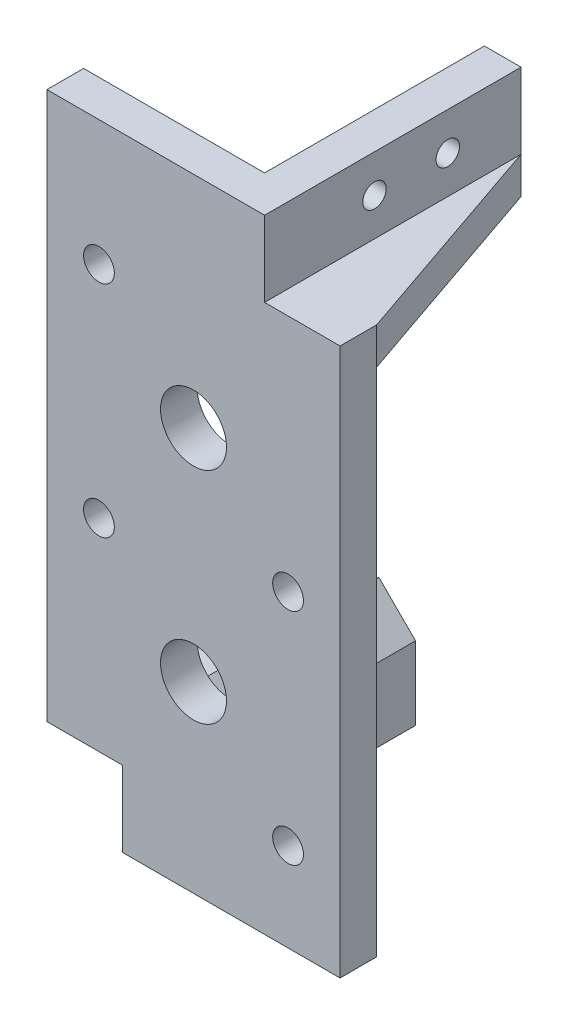
ISO-10303-21;
HEADER;
FILE_DESCRIPTION(('STEP AP214'),'2;1');
FILE_NAME('part.step','',(''),(''),'','','');
FILE_SCHEMA(('AUTOMOTIVE_DESIGN { 1 0 10303 214 1 1 1 1 }'));
ENDSEC;
DATA;
#1=APPLICATION_CONTEXT('core data for automotive mechanical design processes');
#2=APPLICATION_PROTOCOL_DEFINITION('international standard','automotive_design',2000,#1);
#3=PRODUCT_CONTEXT('',#1,'mechanical');
#4=PRODUCT('Part','Part','',(#3));
#5=PRODUCT_RELATED_PRODUCT_CATEGORY('part','',(#4));
#6=PRODUCT_DEFINITION_FORMATION('','',#4);
#7=PRODUCT_DEFINITION_CONTEXT('part definition',#1,'design');
#8=PRODUCT_DEFINITION('design','',#6,#7);
#9=PRODUCT_DEFINITION_SHAPE('','',#8);
#10=(LENGTH_UNIT() NAMED_UNIT(*) SI_UNIT(.MILLI.,.METRE.));
#11=(NAMED_UNIT(*) PLANE_ANGLE_UNIT() SI_UNIT($,.RADIAN.));
#12=(NAMED_UNIT(*) SI_UNIT($,.STERADIAN.) SOLID_ANGLE_UNIT());
#13=UNCERTAINTY_MEASURE_WITH_UNIT(LENGTH_MEASURE(1.E-05),#10,'distance_accuracy_value','');
#14=(GEOMETRIC_REPRESENTATION_CONTEXT(3) GLOBAL_UNCERTAINTY_ASSIGNED_CONTEXT((#13)) GLOBAL_UNIT_ASSIGNED_CONTEXT((#10,
#11,#12)) REPRESENTATION_CONTEXT('',''));
#15=CARTESIAN_POINT('',(0.,0.,0.));
#16=DIRECTION('',(0.,0.,1.));
#17=DIRECTION('',(1.,0.,0.));
#18=AXIS2_PLACEMENT_3D('',#15,#16,#17);
#19=CARTESIAN_POINT('',(0.,0.,0.));
#20=DIRECTION('',(0.,0.,1.));
#21=DIRECTION('',(1.,0.,0.));
#22=AXIS2_PLACEMENT_3D('',#19,#20,#21);
#23=PLANE('',#22);
#24=CARTESIAN_POINT('',(32.9046987566547,-30.4046987566544,0.));
#25=DIRECTION('',(0.,0.,-1.));
#26=DIRECTION('',(-1.,0.,0.));
#27=AXIS2_PLACEMENT_3D('',#24,#25,#26);
#28=CIRCLE('',#27,2.1);
#29=CARTESIAN_POINT('',(30.8046987566547,-30.4046987566544,0.));
#30=VERTEX_POINT('',#29);
#31=EDGE_CURVE('E274',#30,#30,#28,.T.);
#32=ORIENTED_EDGE('',*,*,#31,.F.);
#33=EDGE_LOOP('',(#32));
#34=FACE_BOUND('',#33,.T.);
#35=CARTESIAN_POINT('',(7.09530124334588,25.4046987566544,0.));
#36=DIRECTION('',(0.,0.,-1.));
#37=DIRECTION('',(-1.,0.,0.));
#38=AXIS2_PLACEMENT_3D('',#35,#36,#37);
#39=CIRCLE('',#38,2.1);
#40=CARTESIAN_POINT('',(4.99530124334588,25.4046987566544,0.));
#41=VERTEX_POINT('',#40);
#42=EDGE_CURVE('E275',#41,#41,#39,.T.);
#43=ORIENTED_EDGE('',*,*,#42,.F.);
#44=EDGE_LOOP('',(#43));
#45=FACE_BOUND('',#44,.T.);
#46=CARTESIAN_POINT('',(32.904698756655,-0.404698756654425,0.));
#47=DIRECTION('',(0.,0.,-1.));
#48=DIRECTION('',(-1.,0.,0.));
#49=AXIS2_PLACEMENT_3D('',#46,#47,#48);
#50=CIRCLE('',#49,2.1);
#51=CARTESIAN_POINT('',(30.804698756655,-0.404698756654425,0.));
#52=VERTEX_POINT('',#51);
#53=EDGE_CURVE('E282',#52,#52,#50,.T.);
#54=ORIENTED_EDGE('',*,*,#53,.F.);
#55=EDGE_LOOP('',(#54));
#56=FACE_BOUND('',#55,.T.);
#57=CARTESIAN_POINT('',(20.0000000000001,-17.5,0.));
#58=DIRECTION('',(0.,0.,-1.));
#59=DIRECTION('',(-1.,0.,0.));
#60=AXIS2_PLACEMENT_3D('',#57,#58,#59);
#61=CIRCLE('',#60,4.5);
#62=CARTESIAN_POINT('',(15.5000000000001,-17.5,0.));
#63=VERTEX_POINT('',#62);
#64=EDGE_CURVE('E261',#63,#63,#61,.T.);
#65=ORIENTED_EDGE('',*,*,#64,.F.);
#66=EDGE_LOOP('',(#65));
#67=FACE_BOUND('',#66,.T.);
#68=CARTESIAN_POINT('',(7.09530124334557,-4.59530124334556,0.));
#69=DIRECTION('',(0.,0.,-1.));
#70=DIRECTION('',(-1.,0.,0.));
#71=AXIS2_PLACEMENT_3D('',#68,#69,#70);
#72=CIRCLE('',#71,2.1);
#73=CARTESIAN_POINT('',(4.99530124334556,-4.59530124334556,0.));
#74=VERTEX_POINT('',#73);
#75=EDGE_CURVE('E268',#74,#74,#72,.T.);
#76=ORIENTED_EDGE('',*,*,#75,.F.);
#77=EDGE_LOOP('',(#76));
#78=FACE_BOUND('',#77,.T.);
#79=CARTESIAN_POINT('',(20.0000000000004,12.5,0.));
#80=DIRECTION('',(0.,0.,-1.));
#81=DIRECTION('',(-1.,0.,0.));
#82=AXIS2_PLACEMENT_3D('',#79,#80,#81);
#83=CIRCLE('',#82,4.5);
#84=CARTESIAN_POINT('',(15.5000000000004,12.5,0.));
#85=VERTEX_POINT('',#84);
#86=EDGE_CURVE('E291',#85,#85,#83,.T.);
#87=ORIENTED_EDGE('',*,*,#86,.F.);
#88=EDGE_LOOP('',(#87));
#89=FACE_BOUND('',#88,.T.);
#90=DIRECTION('',(1.,0.,0.));
#91=VECTOR('',#90,1.);
#92=CARTESIAN_POINT('',(10.3,-27.5,0.));
#93=LINE('',#92,#91);
#94=CARTESIAN_POINT('',(0.,-27.5,0.));
#95=VERTEX_POINT('',#94);
#96=CARTESIAN_POINT('',(10.3,-27.5,0.));
#97=VERTEX_POINT('',#96);
#98=EDGE_CURVE('E182',#95,#97,#93,.T.);
#99=ORIENTED_EDGE('',*,*,#98,.F.);
#100=DIRECTION('',(0.,-1.,0.));
#101=VECTOR('',#100,1.);
#102=CARTESIAN_POINT('',(0.,-42.5,0.));
#103=LINE('',#102,#101);
#104=CARTESIAN_POINT('',(0.,42.5,0.));
#105=VERTEX_POINT('',#104);
#106=EDGE_CURVE('E239',#105,#95,#103,.T.);
#107=ORIENTED_EDGE('',*,*,#106,.F.);
#108=DIRECTION('',(-1.,0.,0.));
#109=VECTOR('',#108,1.);
#110=CARTESIAN_POINT('',(-40.,42.5,0.));
#111=LINE('',#110,#109);
#112=CARTESIAN_POINT('',(24.7,42.5,0.));
#113=VERTEX_POINT('',#112);
#114=EDGE_CURVE('E308',#113,#105,#111,.T.);
#115=ORIENTED_EDGE('',*,*,#114,.F.);
#116=DIRECTION('',(0.,1.,0.));
#117=VECTOR('',#116,1.);
#118=CARTESIAN_POINT('',(24.7,42.5,0.));
#119=LINE('',#118,#117);
#120=CARTESIAN_POINT('',(24.7,27.2,0.));
#121=VERTEX_POINT('',#120);
#122=EDGE_CURVE('E225',#121,#113,#119,.T.);
#123=ORIENTED_EDGE('',*,*,#122,.F.);
#124=DIRECTION('',(-1.,0.,0.));
#125=VECTOR('',#124,1.);
#126=CARTESIAN_POINT('',(0.,27.2,0.));
#127=LINE('',#126,#125);
#128=CARTESIAN_POINT('',(40.,27.2,0.));
#129=VERTEX_POINT('',#128);
#130=EDGE_CURVE('E222',#129,#121,#127,.T.);
#131=ORIENTED_EDGE('',*,*,#130,.F.);
#132=DIRECTION('',(0.,1.,0.));
#133=VECTOR('',#132,1.);
#134=CARTESIAN_POINT('',(40.,42.5,0.));
#135=LINE('',#134,#133);
#136=CARTESIAN_POINT('',(40.,-42.5,0.));
#137=VERTEX_POINT('',#136);
#138=EDGE_CURVE('E294',#137,#129,#135,.T.);
#139=ORIENTED_EDGE('',*,*,#138,.F.);
#140=DIRECTION('',(1.,0.,0.));
#141=VECTOR('',#140,1.);
#142=CARTESIAN_POINT('',(-40.,-42.5,0.));
#143=LINE('',#142,#141);
#144=CARTESIAN_POINT('',(15.3,-42.5,0.));
#145=VERTEX_POINT('',#144);
#146=EDGE_CURVE('E300',#145,#137,#143,.T.);
#147=ORIENTED_EDGE('',*,*,#146,.F.);
#148=DIRECTION('',(0.,-1.,0.));
#149=VECTOR('',#148,1.);
#150=CARTESIAN_POINT('',(15.3,-42.5,0.));
#151=LINE('',#150,#149);
#152=CARTESIAN_POINT('',(15.3,-32.5,0.));
#153=VERTEX_POINT('',#152);
#154=EDGE_CURVE('E179',#153,#145,#151,.T.);
#155=ORIENTED_EDGE('',*,*,#154,.F.);
#156=DIRECTION('',(0.707106781186547,-0.707106781186548,0.));
#157=VECTOR('',#156,1.);
#158=CARTESIAN_POINT('',(-8.59999999999998,-8.59999999999998,0.));
#159=LINE('',#158,#157);
#160=EDGE_CURVE('E11',#153,#97,#159,.F.);
#161=ORIENTED_EDGE('',*,*,#160,.T.);
#162=EDGE_LOOP('',(#99,#107,#115,#123,#131,#139,#147,#155,#161));
#163=FACE_BOUND('',#162,.T.);
#164=ADVANCED_FACE('F35',(#34,#45,#56,#67,#78,#89,#163),#23,.F.);
#165=CARTESIAN_POINT('',(40.,42.5,5.));
#166=DIRECTION('',(-1.,0.,0.));
#167=DIRECTION('',(0.,-1.,0.));
#168=AXIS2_PLACEMENT_3D('',#165,#166,#167);
#169=PLANE('',#168);
#170=DIRECTION('',(0.,0.,-1.));
#171=VECTOR('',#170,1.);
#172=CARTESIAN_POINT('',(40.,32.2,5.001));
#173=LINE('',#172,#171);
#174=CARTESIAN_POINT('',(40.,32.2,5.));
#175=VERTEX_POINT('',#174);
#176=CARTESIAN_POINT('',(40.,32.2,0.));
#177=VERTEX_POINT('',#176);
#178=EDGE_CURVE('E250',#175,#177,#173,.T.);
#179=ORIENTED_EDGE('',*,*,#178,.F.);
#180=DIRECTION('',(0.,1.,0.));
#181=VECTOR('',#180,1.);
#182=CARTESIAN_POINT('',(40.,42.5,5.));
#183=LINE('',#182,#181);
#184=CARTESIAN_POINT('',(40.,-42.5,5.));
#185=VERTEX_POINT('',#184);
#186=EDGE_CURVE('E297',#185,#175,#183,.T.);
#187=ORIENTED_EDGE('',*,*,#186,.F.);
#188=DIRECTION('',(0.,0.,-1.));
#189=VECTOR('',#188,1.);
#190=CARTESIAN_POINT('',(40.,-42.5,5.));
#191=LINE('',#190,#189);
#192=EDGE_CURVE('E305',#185,#137,#191,.T.);
#193=ORIENTED_EDGE('',*,*,#192,.T.);
#194=ORIENTED_EDGE('',*,*,#138,.T.);
#195=DIRECTION('',(0.,1.,0.));
#196=VECTOR('',#195,1.);
#197=CARTESIAN_POINT('',(40.,27.2,0.));
#198=LINE('',#197,#196);
#199=EDGE_CURVE('E215',#129,#177,#198,.T.);
#200=ORIENTED_EDGE('',*,*,#199,.T.);
#201=EDGE_LOOP('',(#179,#187,#193,#194,#200));
#202=FACE_BOUND('',#201,.T.);
#203=ADVANCED_FACE('F335',(#202),#169,.F.);
#204=CARTESIAN_POINT('',(-40.,42.5,5.));
#205=DIRECTION('',(0.,-1.,0.));
#206=DIRECTION('',(0.,0.,-1.));
#207=AXIS2_PLACEMENT_3D('',#204,#205,#206);
#208=PLANE('',#207);
#209=DIRECTION('',(0.,0.,-1.));
#210=VECTOR('',#209,1.);
#211=CARTESIAN_POINT('',(29.7,42.5,5.001));
#212=LINE('',#211,#210);
#213=CARTESIAN_POINT('',(29.7,42.5,5.));
#214=VERTEX_POINT('',#213);
#215=CARTESIAN_POINT('',(29.7,42.5,-30.));
#216=VERTEX_POINT('',#215);
#217=EDGE_CURVE('E251',#214,#216,#212,.T.);
#218=ORIENTED_EDGE('',*,*,#217,.T.);
#219=DIRECTION('',(1.,0.,0.));
#220=VECTOR('',#219,1.);
#221=CARTESIAN_POINT('',(29.7,42.5,-30.));
#222=LINE('',#221,#220);
#223=CARTESIAN_POINT('',(24.7,42.5,-30.));
#224=VERTEX_POINT('',#223);
#225=EDGE_CURVE('E231',#224,#216,#222,.T.);
#226=ORIENTED_EDGE('',*,*,#225,.F.);
#227=DIRECTION('',(0.,0.,1.));
#228=VECTOR('',#227,1.);
#229=CARTESIAN_POINT('',(24.7,42.5,-30.));
#230=LINE('',#229,#228);
#231=EDGE_CURVE('E234',#224,#113,#230,.T.);
#232=ORIENTED_EDGE('',*,*,#231,.T.);
#233=ORIENTED_EDGE('',*,*,#114,.T.);
#234=DIRECTION('',(0.,0.,-1.));
#235=VECTOR('',#234,1.);
#236=CARTESIAN_POINT('',(0.,42.5,10.));
#237=LINE('',#236,#235);
#238=CARTESIAN_POINT('',(0.,42.5,5.));
#239=VERTEX_POINT('',#238);
#240=EDGE_CURVE('E242',#239,#105,#237,.T.);
#241=ORIENTED_EDGE('',*,*,#240,.F.);
#242=DIRECTION('',(-1.,0.,0.));
#243=VECTOR('',#242,1.);
#244=CARTESIAN_POINT('',(-40.,42.5,5.));
#245=LINE('',#244,#243);
#246=EDGE_CURVE('E299',#214,#239,#245,.T.);
#247=ORIENTED_EDGE('',*,*,#246,.F.);
#248=EDGE_LOOP('',(#218,#226,#232,#233,#241,#247));
#249=FACE_BOUND('',#248,.T.);
#250=ADVANCED_FACE('F358',(#249),#208,.F.);
#251=CARTESIAN_POINT('',(-40.,-42.5,5.));
#252=DIRECTION('',(0.,1.,0.));
#253=DIRECTION('',(0.,0.,1.));
#254=AXIS2_PLACEMENT_3D('',#251,#252,#253);
#255=PLANE('',#254);
#256=DIRECTION('',(1.,0.,0.));
#257=VECTOR('',#256,1.);
#258=CARTESIAN_POINT('',(-40.,-42.5,5.));
#259=LINE('',#258,#257);
#260=CARTESIAN_POINT('',(10.3,-42.5,5.));
#261=VERTEX_POINT('',#260);
#262=EDGE_CURVE('E303',#261,#185,#259,.T.);
#263=ORIENTED_EDGE('',*,*,#262,.F.);
#264=DIRECTION('',(0.,0.,-1.));
#265=VECTOR('',#264,1.);
#266=CARTESIAN_POINT('',(10.3,-42.5,5.001));
#267=LINE('',#266,#265);
#268=CARTESIAN_POINT('',(10.3,-42.5,-30.));
#269=VERTEX_POINT('',#268);
#270=EDGE_CURVE('E198',#261,#269,#267,.T.);
#271=ORIENTED_EDGE('',*,*,#270,.T.);
#272=DIRECTION('',(-1.,0.,0.));
#273=VECTOR('',#272,1.);
#274=CARTESIAN_POINT('',(10.3,-42.5,-30.));
#275=LINE('',#274,#273);
#276=CARTESIAN_POINT('',(15.3,-42.5,-30.));
#277=VERTEX_POINT('',#276);
#278=EDGE_CURVE('E177',#277,#269,#275,.T.);
#279=ORIENTED_EDGE('',*,*,#278,.F.);
#280=DIRECTION('',(0.,0.,1.));
#281=VECTOR('',#280,1.);
#282=CARTESIAN_POINT('',(15.3,-42.5,-30.));
#283=LINE('',#282,#281);
#284=EDGE_CURVE('E187',#277,#145,#283,.T.);
#285=ORIENTED_EDGE('',*,*,#284,.T.);
#286=ORIENTED_EDGE('',*,*,#146,.T.);
#287=ORIENTED_EDGE('',*,*,#192,.F.);
#288=EDGE_LOOP('',(#263,#271,#279,#285,#286,#287));
#289=FACE_BOUND('',#288,.T.);
#290=ADVANCED_FACE('F331',(#289),#255,.F.);
#291=CARTESIAN_POINT('',(0.,0.,5.));
#292=DIRECTION('',(0.,0.,1.));
#293=DIRECTION('',(1.,0.,0.));
#294=AXIS2_PLACEMENT_3D('',#291,#292,#293);
#295=PLANE('',#294);
#296=DIRECTION('',(0.,-1.,0.));
#297=VECTOR('',#296,1.);
#298=CARTESIAN_POINT('',(10.3,-42.5,5.));
#299=LINE('',#298,#297);
#300=CARTESIAN_POINT('',(10.3,-32.2,5.));
#301=VERTEX_POINT('',#300);
#302=EDGE_CURVE('E191',#301,#261,#299,.T.);
#303=ORIENTED_EDGE('',*,*,#302,.T.);
#304=ORIENTED_EDGE('',*,*,#262,.T.);
#305=ORIENTED_EDGE('',*,*,#186,.T.);
#306=DIRECTION('',(-1.,0.,0.));
#307=VECTOR('',#306,1.);
#308=CARTESIAN_POINT('',(40.,32.2,5.));
#309=LINE('',#308,#307);
#310=CARTESIAN_POINT('',(29.7,32.2,5.));
#311=VERTEX_POINT('',#310);
#312=EDGE_CURVE('E253',#175,#311,#309,.T.);
#313=ORIENTED_EDGE('',*,*,#312,.T.);
#314=DIRECTION('',(0.,1.,0.));
#315=VECTOR('',#314,1.);
#316=CARTESIAN_POINT('',(29.7,42.5,5.));
#317=LINE('',#316,#315);
#318=EDGE_CURVE('E247',#311,#214,#317,.T.);
#319=ORIENTED_EDGE('',*,*,#318,.T.);
#320=ORIENTED_EDGE('',*,*,#246,.T.);
#321=DIRECTION('',(0.,1.,0.));
#322=VECTOR('',#321,1.);
#323=CARTESIAN_POINT('',(0.,0.,5.));
#324=LINE('',#323,#322);
#325=CARTESIAN_POINT('',(0.,-32.2,5.));
#326=VERTEX_POINT('',#325);
#327=EDGE_CURVE('E245',#326,#239,#324,.T.);
#328=ORIENTED_EDGE('',*,*,#327,.F.);
#329=DIRECTION('',(1.,0.,0.));
#330=VECTOR('',#329,1.);
#331=CARTESIAN_POINT('',(0.,-32.2,5.));
#332=LINE('',#331,#330);
#333=EDGE_CURVE('E200',#326,#301,#332,.T.);
#334=ORIENTED_EDGE('',*,*,#333,.T.);
#335=EDGE_LOOP('',(#303,#304,#305,#313,#319,#320,#328,#334));
#336=FACE_BOUND('',#335,.T.);
#337=CARTESIAN_POINT('',(32.9046987566547,-30.4046987566544,5.));
#338=DIRECTION('',(0.,0.,1.));
#339=DIRECTION('',(1.,0.,0.));
#340=AXIS2_PLACEMENT_3D('',#337,#338,#339);
#341=CIRCLE('',#340,2.1);
#342=CARTESIAN_POINT('',(35.0046987566547,-30.4046987566544,5.));
#343=VERTEX_POINT('',#342);
#344=EDGE_CURVE('E260',#343,#343,#341,.F.);
#345=ORIENTED_EDGE('',*,*,#344,.T.);
#346=EDGE_LOOP('',(#345));
#347=FACE_BOUND('',#346,.T.);
#348=CARTESIAN_POINT('',(7.09530124334588,25.4046987566544,5.));
#349=DIRECTION('',(0.,0.,1.));
#350=DIRECTION('',(1.,0.,0.));
#351=AXIS2_PLACEMENT_3D('',#348,#349,#350);
#352=CIRCLE('',#351,2.1);
#353=CARTESIAN_POINT('',(9.19530124334588,25.4046987566544,5.));
#354=VERTEX_POINT('',#353);
#355=EDGE_CURVE('E279',#354,#354,#352,.F.);
#356=ORIENTED_EDGE('',*,*,#355,.T.);
#357=EDGE_LOOP('',(#356));
#358=FACE_BOUND('',#357,.T.);
#359=CARTESIAN_POINT('',(32.904698756655,-0.404698756654425,5.));
#360=DIRECTION('',(0.,0.,1.));
#361=DIRECTION('',(1.,0.,0.));
#362=AXIS2_PLACEMENT_3D('',#359,#360,#361);
#363=CIRCLE('',#362,2.1);
#364=CARTESIAN_POINT('',(35.004698756655,-0.404698756654425,5.));
#365=VERTEX_POINT('',#364);
#366=EDGE_CURVE('E264',#365,#365,#363,.F.);
#367=ORIENTED_EDGE('',*,*,#366,.T.);
#368=EDGE_LOOP('',(#367));
#369=FACE_BOUND('',#368,.T.);
#370=CARTESIAN_POINT('',(20.0000000000001,-17.5,5.));
#371=DIRECTION('',(0.,0.,1.));
#372=DIRECTION('',(1.,0.,0.));
#373=AXIS2_PLACEMENT_3D('',#370,#371,#372);
#374=CIRCLE('',#373,4.5);
#375=CARTESIAN_POINT('',(24.5000000000001,-17.5,5.));
#376=VERTEX_POINT('',#375);
#377=EDGE_CURVE('E265',#376,#376,#374,.F.);
#378=ORIENTED_EDGE('',*,*,#377,.T.);
#379=EDGE_LOOP('',(#378));
#380=FACE_BOUND('',#379,.T.);
#381=CARTESIAN_POINT('',(7.09530124334557,-4.59530124334556,5.));
#382=DIRECTION('',(0.,0.,1.));
#383=DIRECTION('',(1.,0.,0.));
#384=AXIS2_PLACEMENT_3D('',#381,#382,#383);
#385=CIRCLE('',#384,2.1);
#386=CARTESIAN_POINT('',(9.19530124334557,-4.59530124334556,5.));
#387=VERTEX_POINT('',#386);
#388=EDGE_CURVE('E271',#387,#387,#385,.F.);
#389=ORIENTED_EDGE('',*,*,#388,.T.);
#390=EDGE_LOOP('',(#389));
#391=FACE_BOUND('',#390,.T.);
#392=CARTESIAN_POINT('',(20.0000000000004,12.5,5.));
#393=DIRECTION('',(0.,0.,1.));
#394=DIRECTION('',(1.,0.,0.));
#395=AXIS2_PLACEMENT_3D('',#392,#393,#394);
#396=CIRCLE('',#395,4.5);
#397=CARTESIAN_POINT('',(24.5000000000004,12.5,5.));
#398=VERTEX_POINT('',#397);
#399=EDGE_CURVE('E278',#398,#398,#396,.F.);
#400=ORIENTED_EDGE('',*,*,#399,.T.);
#401=EDGE_LOOP('',(#400));
#402=FACE_BOUND('',#401,.T.);
#403=ADVANCED_FACE('F338',(#336,#347,#358,#369,#380,#391,#402),#295,.T.);
#404=CARTESIAN_POINT('',(20.0000000000004,12.5,5.001));
#405=DIRECTION('',(0.,0.,-1.));
#406=DIRECTION('',(-1.,0.,0.));
#407=AXIS2_PLACEMENT_3D('',#404,#405,#406);
#408=CYLINDRICAL_SURFACE('',#407,4.5);
#409=ORIENTED_EDGE('',*,*,#399,.F.);
#410=EDGE_LOOP('',(#409));
#411=FACE_BOUND('',#410,.T.);
#412=ORIENTED_EDGE('',*,*,#86,.T.);
#413=EDGE_LOOP('',(#412));
#414=FACE_BOUND('',#413,.T.);
#415=ADVANCED_FACE('F411',(#411,#414),#408,.F.);
#416=CARTESIAN_POINT('',(7.09530124334557,-4.59530124334556,5.001));
#417=DIRECTION('',(0.,0.,-1.));
#418=DIRECTION('',(-1.,0.,0.));
#419=AXIS2_PLACEMENT_3D('',#416,#417,#418);
#420=CYLINDRICAL_SURFACE('',#419,2.1);
#421=ORIENTED_EDGE('',*,*,#388,.F.);
#422=EDGE_LOOP('',(#421));
#423=FACE_BOUND('',#422,.T.);
#424=ORIENTED_EDGE('',*,*,#75,.T.);
#425=EDGE_LOOP('',(#424));
#426=FACE_BOUND('',#425,.T.);
#427=ADVANCED_FACE('F418',(#423,#426),#420,.F.);
#428=CARTESIAN_POINT('',(20.0000000000001,-17.5,5.001));
#429=DIRECTION('',(0.,0.,-1.));
#430=DIRECTION('',(-1.,0.,0.));
#431=AXIS2_PLACEMENT_3D('',#428,#429,#430);
#432=CYLINDRICAL_SURFACE('',#431,4.5);
#433=ORIENTED_EDGE('',*,*,#377,.F.);
#434=EDGE_LOOP('',(#433));
#435=FACE_BOUND('',#434,.T.);
#436=ORIENTED_EDGE('',*,*,#64,.T.);
#437=EDGE_LOOP('',(#436));
#438=FACE_BOUND('',#437,.T.);
#439=ADVANCED_FACE('F425',(#435,#438),#432,.F.);
#440=CARTESIAN_POINT('',(32.904698756655,-0.404698756654425,5.001));
#441=DIRECTION('',(0.,0.,-1.));
#442=DIRECTION('',(-1.,0.,0.));
#443=AXIS2_PLACEMENT_3D('',#440,#441,#442);
#444=CYLINDRICAL_SURFACE('',#443,2.1);
#445=ORIENTED_EDGE('',*,*,#366,.F.);
#446=EDGE_LOOP('',(#445));
#447=FACE_BOUND('',#446,.T.);
#448=ORIENTED_EDGE('',*,*,#53,.T.);
#449=EDGE_LOOP('',(#448));
#450=FACE_BOUND('',#449,.T.);
#451=ADVANCED_FACE('F433',(#447,#450),#444,.F.);
#452=CARTESIAN_POINT('',(7.09530124334588,25.4046987566544,5.001));
#453=DIRECTION('',(0.,0.,-1.));
#454=DIRECTION('',(-1.,0.,0.));
#455=AXIS2_PLACEMENT_3D('',#452,#453,#454);
#456=CYLINDRICAL_SURFACE('',#455,2.1);
#457=ORIENTED_EDGE('',*,*,#355,.F.);
#458=EDGE_LOOP('',(#457));
#459=FACE_BOUND('',#458,.T.);
#460=ORIENTED_EDGE('',*,*,#42,.T.);
#461=EDGE_LOOP('',(#460));
#462=FACE_BOUND('',#461,.T.);
#463=ADVANCED_FACE('F441',(#459,#462),#456,.F.);
#464=CARTESIAN_POINT('',(32.9046987566547,-30.4046987566544,5.001));
#465=DIRECTION('',(0.,0.,-1.));
#466=DIRECTION('',(-1.,0.,0.));
#467=AXIS2_PLACEMENT_3D('',#464,#465,#466);
#468=CYLINDRICAL_SURFACE('',#467,2.1);
#469=ORIENTED_EDGE('',*,*,#344,.F.);
#470=EDGE_LOOP('',(#469));
#471=FACE_BOUND('',#470,.T.);
#472=ORIENTED_EDGE('',*,*,#31,.T.);
#473=EDGE_LOOP('',(#472));
#474=FACE_BOUND('',#473,.T.);
#475=ADVANCED_FACE('F449',(#471,#474),#468,.F.);
#476=CARTESIAN_POINT('',(29.7,42.5,5.001));
#477=DIRECTION('',(-1.,0.,0.));
#478=DIRECTION('',(0.,-1.,0.));
#479=AXIS2_PLACEMENT_3D('',#476,#477,#478);
#480=PLANE('',#479);
#481=CARTESIAN_POINT('',(29.7,37.35,-20.));
#482=DIRECTION('',(1.,0.,0.));
#483=DIRECTION('',(0.,1.,0.));
#484=AXIS2_PLACEMENT_3D('',#481,#482,#483);
#485=CIRCLE('',#484,1.6);
#486=CARTESIAN_POINT('',(29.7,38.95,-20.));
#487=VERTEX_POINT('',#486);
#488=EDGE_CURVE('E676',#487,#487,#485,.T.);
#489=ORIENTED_EDGE('',*,*,#488,.F.);
#490=EDGE_LOOP('',(#489));
#491=FACE_BOUND('',#490,.T.);
#492=CARTESIAN_POINT('',(29.7,37.35,-10.));
#493=DIRECTION('',(1.,0.,0.));
#494=DIRECTION('',(0.,1.,0.));
#495=AXIS2_PLACEMENT_3D('',#492,#493,#494);
#496=CIRCLE('',#495,1.6);
#497=CARTESIAN_POINT('',(29.7,38.95,-10.));
#498=VERTEX_POINT('',#497);
#499=EDGE_CURVE('E688',#498,#498,#496,.T.);
#500=ORIENTED_EDGE('',*,*,#499,.F.);
#501=EDGE_LOOP('',(#500));
#502=FACE_BOUND('',#501,.T.);
#503=DIRECTION('',(0.,0.,-1.));
#504=VECTOR('',#503,1.);
#505=CARTESIAN_POINT('',(29.7,32.2,5.001));
#506=LINE('',#505,#504);
#507=CARTESIAN_POINT('',(29.7,32.2,-30.));
#508=VERTEX_POINT('',#507);
#509=EDGE_CURVE('E254',#311,#508,#506,.T.);
#510=ORIENTED_EDGE('',*,*,#509,.T.);
#511=DIRECTION('',(0.,-1.,0.));
#512=VECTOR('',#511,1.);
#513=CARTESIAN_POINT('',(29.7,42.5,-30.));
#514=LINE('',#513,#512);
#515=EDGE_CURVE('E226',#216,#508,#514,.T.);
#516=ORIENTED_EDGE('',*,*,#515,.F.);
#517=ORIENTED_EDGE('',*,*,#217,.F.);
#518=ORIENTED_EDGE('',*,*,#318,.F.);
#519=EDGE_LOOP('',(#510,#516,#517,#518));
#520=FACE_BOUND('',#519,.T.);
#521=ADVANCED_FACE('F346',(#491,#502,#520),#480,.F.);
#522=CARTESIAN_POINT('',(40.,32.2,5.001));
#523=DIRECTION('',(0.,-1.,0.));
#524=DIRECTION('',(0.,0.,-1.));
#525=AXIS2_PLACEMENT_3D('',#522,#523,#524);
#526=PLANE('',#525);
#527=ORIENTED_EDGE('',*,*,#178,.T.);
#528=DIRECTION('',(0.324727305226086,0.,0.945807685124521));
#529=VECTOR('',#528,1.);
#530=CARTESIAN_POINT('',(40.,32.2,0.));
#531=LINE('',#530,#529);
#532=EDGE_CURVE('E207',#508,#177,#531,.T.);
#533=ORIENTED_EDGE('',*,*,#532,.F.);
#534=ORIENTED_EDGE('',*,*,#509,.F.);
#535=ORIENTED_EDGE('',*,*,#312,.F.);
#536=EDGE_LOOP('',(#527,#533,#534,#535));
#537=FACE_BOUND('',#536,.T.);
#538=ADVANCED_FACE('F342',(#537),#526,.F.);
#539=CARTESIAN_POINT('',(0.,-42.5,10.));
#540=DIRECTION('',(1.,0.,0.));
#541=DIRECTION('',(0.,0.,-1.));
#542=AXIS2_PLACEMENT_3D('',#539,#540,#541);
#543=PLANE('',#542);
#544=ORIENTED_EDGE('',*,*,#106,.T.);
#545=DIRECTION('',(0.,1.,0.));
#546=VECTOR('',#545,1.);
#547=CARTESIAN_POINT('',(0.,-32.5,0.));
#548=LINE('',#547,#546);
#549=CARTESIAN_POINT('',(0.,-32.2,0.));
#550=VERTEX_POINT('',#549);
#551=EDGE_CURVE('E157',#550,#95,#548,.T.);
#552=ORIENTED_EDGE('',*,*,#551,.F.);
#553=DIRECTION('',(0.,0.,-1.));
#554=VECTOR('',#553,1.);
#555=CARTESIAN_POINT('',(0.,-32.2,5.001));
#556=LINE('',#555,#554);
#557=EDGE_CURVE('E197',#326,#550,#556,.T.);
#558=ORIENTED_EDGE('',*,*,#557,.F.);
#559=ORIENTED_EDGE('',*,*,#327,.T.);
#560=ORIENTED_EDGE('',*,*,#240,.T.);
#561=EDGE_LOOP('',(#544,#552,#558,#559,#560));
#562=FACE_BOUND('',#561,.T.);
#563=ADVANCED_FACE('F364',(#562),#543,.F.);
#564=CARTESIAN_POINT('',(24.7,42.5,-30.));
#565=DIRECTION('',(1.,0.,0.));
#566=DIRECTION('',(0.,0.,-1.));
#567=AXIS2_PLACEMENT_3D('',#564,#565,#566);
#568=PLANE('',#567);
#569=CARTESIAN_POINT('',(24.7,37.35,-20.));
#570=DIRECTION('',(1.,0.,0.));
#571=DIRECTION('',(0.,0.,-1.));
#572=AXIS2_PLACEMENT_3D('',#569,#570,#571);
#573=CIRCLE('',#572,1.6);
#574=CARTESIAN_POINT('',(24.7,37.35,-21.6));
#575=VERTEX_POINT('',#574);
#576=EDGE_CURVE('E679',#575,#575,#573,.F.);
#577=ORIENTED_EDGE('',*,*,#576,.F.);
#578=EDGE_LOOP('',(#577));
#579=FACE_BOUND('',#578,.T.);
#580=CARTESIAN_POINT('',(24.7,37.35,-10.));
#581=DIRECTION('',(1.,0.,0.));
#582=DIRECTION('',(0.,0.,-1.));
#583=AXIS2_PLACEMENT_3D('',#580,#581,#582);
#584=CIRCLE('',#583,1.6);
#585=CARTESIAN_POINT('',(24.7,37.35,-11.6));
#586=VERTEX_POINT('',#585);
#587=EDGE_CURVE('E685',#586,#586,#584,.F.);
#588=ORIENTED_EDGE('',*,*,#587,.F.);
#589=EDGE_LOOP('',(#588));
#590=FACE_BOUND('',#589,.T.);
#591=ORIENTED_EDGE('',*,*,#122,.T.);
#592=ORIENTED_EDGE('',*,*,#231,.F.);
#593=DIRECTION('',(0.,1.,0.));
#594=VECTOR('',#593,1.);
#595=CARTESIAN_POINT('',(24.7,42.5,-30.));
#596=LINE('',#595,#594);
#597=CARTESIAN_POINT('',(24.7,27.2,-30.));
#598=VERTEX_POINT('',#597);
#599=EDGE_CURVE('E229',#598,#224,#596,.T.);
#600=ORIENTED_EDGE('',*,*,#599,.F.);
#601=DIRECTION('',(0.,0.,-1.));
#602=VECTOR('',#601,1.);
#603=CARTESIAN_POINT('',(24.7,27.2,-30.));
#604=LINE('',#603,#602);
#605=EDGE_CURVE('E208',#121,#598,#604,.T.);
#606=ORIENTED_EDGE('',*,*,#605,.F.);
#607=EDGE_LOOP('',(#591,#592,#600,#606));
#608=FACE_BOUND('',#607,.T.);
#609=ADVANCED_FACE('F369',(#579,#590,#608),#568,.F.);
#610=CARTESIAN_POINT('',(0.,0.,-30.));
#611=DIRECTION('',(0.,0.,-1.));
#612=DIRECTION('',(-1.,0.,0.));
#613=AXIS2_PLACEMENT_3D('',#610,#611,#612);
#614=PLANE('',#613);
#615=ORIENTED_EDGE('',*,*,#515,.T.);
#616=DIRECTION('',(0.,1.,0.));
#617=VECTOR('',#616,1.);
#618=CARTESIAN_POINT('',(29.7,27.2,-30.));
#619=LINE('',#618,#617);
#620=CARTESIAN_POINT('',(29.7,27.2,-30.));
#621=VERTEX_POINT('',#620);
#622=EDGE_CURVE('E219',#621,#508,#619,.T.);
#623=ORIENTED_EDGE('',*,*,#622,.F.);
#624=DIRECTION('',(1.,0.,0.));
#625=VECTOR('',#624,1.);
#626=CARTESIAN_POINT('',(29.7,27.2,-30.));
#627=LINE('',#626,#625);
#628=EDGE_CURVE('E211',#598,#621,#627,.T.);
#629=ORIENTED_EDGE('',*,*,#628,.F.);
#630=ORIENTED_EDGE('',*,*,#599,.T.);
#631=ORIENTED_EDGE('',*,*,#225,.T.);
#632=EDGE_LOOP('',(#615,#623,#629,#630,#631));
#633=FACE_BOUND('',#632,.T.);
#634=ADVANCED_FACE('F354',(#633),#614,.T.);
#635=CARTESIAN_POINT('',(0.,27.2,0.));
#636=DIRECTION('',(0.,1.,0.));
#637=DIRECTION('',(0.,0.,1.));
#638=AXIS2_PLACEMENT_3D('',#635,#636,#637);
#639=PLANE('',#638);
#640=DIRECTION('',(0.324727305226086,0.,0.945807685124521));
#641=VECTOR('',#640,1.);
#642=CARTESIAN_POINT('',(40.,27.2,0.));
#643=LINE('',#642,#641);
#644=EDGE_CURVE('E213',#621,#129,#643,.T.);
#645=ORIENTED_EDGE('',*,*,#644,.T.);
#646=ORIENTED_EDGE('',*,*,#130,.T.);
#647=ORIENTED_EDGE('',*,*,#605,.T.);
#648=ORIENTED_EDGE('',*,*,#628,.T.);
#649=EDGE_LOOP('',(#645,#646,#647,#648));
#650=FACE_BOUND('',#649,.T.);
#651=ADVANCED_FACE('F371',(#650),#639,.F.);
#652=CARTESIAN_POINT('',(40.,27.2,0.));
#653=DIRECTION('',(-0.945807685124521,0.,0.324727305226086));
#654=DIRECTION('',(0.324727305226086,0.,0.945807685124521));
#655=AXIS2_PLACEMENT_3D('',#652,#653,#654);
#656=PLANE('',#655);
#657=ORIENTED_EDGE('',*,*,#532,.T.);
#658=ORIENTED_EDGE('',*,*,#199,.F.);
#659=ORIENTED_EDGE('',*,*,#644,.F.);
#660=ORIENTED_EDGE('',*,*,#622,.T.);
#661=EDGE_LOOP('',(#657,#658,#659,#660));
#662=FACE_BOUND('',#661,.T.);
#663=ADVANCED_FACE('F350',(#662),#656,.F.);
#664=CARTESIAN_POINT('',(10.3,-42.5,5.001));
#665=DIRECTION('',(1.,0.,0.));
#666=DIRECTION('',(0.,0.,-1.));
#667=AXIS2_PLACEMENT_3D('',#664,#665,#666);
#668=PLANE('',#667);
#669=CARTESIAN_POINT('',(10.3,-37.4571428571428,-20.));
#670=DIRECTION('',(-1.,0.,0.));
#671=DIRECTION('',(0.,0.,1.));
#672=AXIS2_PLACEMENT_3D('',#669,#670,#671);
#673=CIRCLE('',#672,1.6);
#674=CARTESIAN_POINT('',(10.3,-37.4571428571428,-18.4));
#675=VERTEX_POINT('',#674);
#676=EDGE_CURVE('E693',#675,#675,#673,.T.);
#677=ORIENTED_EDGE('',*,*,#676,.F.);
#678=EDGE_LOOP('',(#677));
#679=FACE_BOUND('',#678,.T.);
#680=CARTESIAN_POINT('',(10.3,-37.4142857142857,-10.));
#681=DIRECTION('',(-1.,0.,0.));
#682=DIRECTION('',(0.,0.,1.));
#683=AXIS2_PLACEMENT_3D('',#680,#681,#682);
#684=CIRCLE('',#683,1.6);
#685=CARTESIAN_POINT('',(10.3,-37.4142857142857,-8.4));
#686=VERTEX_POINT('',#685);
#687=EDGE_CURVE('E680',#686,#686,#684,.T.);
#688=ORIENTED_EDGE('',*,*,#687,.F.);
#689=EDGE_LOOP('',(#688));
#690=FACE_BOUND('',#689,.T.);
#691=DIRECTION('',(0.,0.,-1.));
#692=VECTOR('',#691,1.);
#693=CARTESIAN_POINT('',(10.3,-32.2,5.001));
#694=LINE('',#693,#692);
#695=CARTESIAN_POINT('',(10.3,-32.2,0.));
#696=VERTEX_POINT('',#695);
#697=EDGE_CURVE('E201',#301,#696,#694,.T.);
#698=ORIENTED_EDGE('',*,*,#697,.T.);
#699=DIRECTION('',(0.,1.,0.));
#700=VECTOR('',#699,1.);
#701=CARTESIAN_POINT('',(10.3,-32.5,0.));
#702=LINE('',#701,#700);
#703=CARTESIAN_POINT('',(10.3,-32.5,0.));
#704=VERTEX_POINT('',#703);
#705=EDGE_CURVE('E172',#704,#696,#702,.T.);
#706=ORIENTED_EDGE('',*,*,#705,.F.);
#707=DIRECTION('',(0.,0.,-1.));
#708=VECTOR('',#707,1.);
#709=CARTESIAN_POINT('',(10.3,-32.5,0.));
#710=LINE('',#709,#708);
#711=CARTESIAN_POINT('',(10.3,-32.5,-30.));
#712=VERTEX_POINT('',#711);
#713=EDGE_CURVE('E163',#704,#712,#710,.T.);
#714=ORIENTED_EDGE('',*,*,#713,.T.);
#715=DIRECTION('',(0.,1.,0.));
#716=VECTOR('',#715,1.);
#717=CARTESIAN_POINT('',(10.3,-42.5,-30.));
#718=LINE('',#717,#716);
#719=EDGE_CURVE('E171',#269,#712,#718,.T.);
#720=ORIENTED_EDGE('',*,*,#719,.F.);
#721=ORIENTED_EDGE('',*,*,#270,.F.);
#722=ORIENTED_EDGE('',*,*,#302,.F.);
#723=EDGE_LOOP('',(#698,#706,#714,#720,#721,#722));
#724=FACE_BOUND('',#723,.T.);
#725=ADVANCED_FACE('F170',(#679,#690,#724),#668,.F.);
#726=CARTESIAN_POINT('',(0.,-32.2,5.001));
#727=DIRECTION('',(0.,1.,0.));
#728=DIRECTION('',(0.,0.,1.));
#729=AXIS2_PLACEMENT_3D('',#726,#727,#728);
#730=PLANE('',#729);
#731=ORIENTED_EDGE('',*,*,#557,.T.);
#732=DIRECTION('',(1.,0.,0.));
#733=VECTOR('',#732,1.);
#734=CARTESIAN_POINT('',(0.,-32.2,0.));
#735=LINE('',#734,#733);
#736=EDGE_CURVE('E194',#550,#696,#735,.T.);
#737=ORIENTED_EDGE('',*,*,#736,.T.);
#738=ORIENTED_EDGE('',*,*,#697,.F.);
#739=ORIENTED_EDGE('',*,*,#333,.F.);
#740=EDGE_LOOP('',(#731,#737,#738,#739));
#741=FACE_BOUND('',#740,.T.);
#742=ADVANCED_FACE('F508',(#741),#730,.F.);
#743=CARTESIAN_POINT('',(10.3,-27.5,-30.));
#744=DIRECTION('',(0.,-1.,0.));
#745=DIRECTION('',(0.,0.,-1.));
#746=AXIS2_PLACEMENT_3D('',#743,#744,#745);
#747=PLANE('',#746);
#748=ORIENTED_EDGE('',*,*,#98,.T.);
#749=DIRECTION('',(0.,0.,-1.));
#750=VECTOR('',#749,1.);
#751=CARTESIAN_POINT('',(10.3,-27.5,-30.));
#752=LINE('',#751,#750);
#753=CARTESIAN_POINT('',(10.3,-27.5,-30.));
#754=VERTEX_POINT('',#753);
#755=EDGE_CURVE('E316',#97,#754,#752,.T.);
#756=ORIENTED_EDGE('',*,*,#755,.T.);
#757=DIRECTION('',(-0.324727305226086,0.,0.945807685124521));
#758=VECTOR('',#757,1.);
#759=CARTESIAN_POINT('',(10.3,-27.5,-30.));
#760=LINE('',#759,#758);
#761=EDGE_CURVE('E155',#754,#95,#760,.T.);
#762=ORIENTED_EDGE('',*,*,#761,.T.);
#763=EDGE_LOOP('',(#748,#756,#762));
#764=FACE_BOUND('',#763,.T.);
#765=ADVANCED_FACE('F319',(#764),#747,.F.);
#766=CARTESIAN_POINT('',(15.3,-42.5,-30.));
#767=DIRECTION('',(-1.,0.,0.));
#768=DIRECTION('',(0.,0.,1.));
#769=AXIS2_PLACEMENT_3D('',#766,#767,#768);
#770=PLANE('',#769);
#771=CARTESIAN_POINT('',(15.3,-37.4571428571428,-20.));
#772=DIRECTION('',(-1.,0.,0.));
#773=DIRECTION('',(0.,0.,1.));
#774=AXIS2_PLACEMENT_3D('',#771,#772,#773);
#775=CIRCLE('',#774,1.6);
#776=CARTESIAN_POINT('',(15.3,-37.4571428571428,-18.4));
#777=VERTEX_POINT('',#776);
#778=EDGE_CURVE('E696',#777,#777,#775,.F.);
#779=ORIENTED_EDGE('',*,*,#778,.F.);
#780=EDGE_LOOP('',(#779));
#781=FACE_BOUND('',#780,.T.);
#782=CARTESIAN_POINT('',(15.3,-37.4142857142857,-10.));
#783=DIRECTION('',(-1.,0.,0.));
#784=DIRECTION('',(0.,0.,1.));
#785=AXIS2_PLACEMENT_3D('',#782,#783,#784);
#786=CIRCLE('',#785,1.6);
#787=CARTESIAN_POINT('',(15.3,-37.4142857142857,-8.4));
#788=VERTEX_POINT('',#787);
#789=EDGE_CURVE('E683',#788,#788,#786,.F.);
#790=ORIENTED_EDGE('',*,*,#789,.F.);
#791=EDGE_LOOP('',(#790));
#792=FACE_BOUND('',#791,.T.);
#793=DIRECTION('',(0.,-1.,0.));
#794=VECTOR('',#793,1.);
#795=CARTESIAN_POINT('',(15.3,-42.5,-30.));
#796=LINE('',#795,#794);
#797=CARTESIAN_POINT('',(15.3,-32.5,-30.));
#798=VERTEX_POINT('',#797);
#799=EDGE_CURVE('E178',#798,#277,#796,.T.);
#800=ORIENTED_EDGE('',*,*,#799,.F.);
#801=DIRECTION('',(0.,0.,1.));
#802=VECTOR('',#801,1.);
#803=CARTESIAN_POINT('',(15.3,-32.5,-30.));
#804=LINE('',#803,#802);
#805=EDGE_CURVE('E313',#798,#153,#804,.T.);
#806=ORIENTED_EDGE('',*,*,#805,.T.);
#807=ORIENTED_EDGE('',*,*,#154,.T.);
#808=ORIENTED_EDGE('',*,*,#284,.F.);
#809=EDGE_LOOP('',(#800,#806,#807,#808));
#810=FACE_BOUND('',#809,.T.);
#811=ADVANCED_FACE('F323',(#781,#792,#810),#770,.F.);
#812=CARTESIAN_POINT('',(0.,0.,-30.));
#813=DIRECTION('',(0.,0.,-1.));
#814=DIRECTION('',(-1.,0.,0.));
#815=AXIS2_PLACEMENT_3D('',#812,#813,#814);
#816=PLANE('',#815);
#817=DIRECTION('',(0.,1.,0.));
#818=VECTOR('',#817,1.);
#819=CARTESIAN_POINT('',(10.3,-32.5,-30.));
#820=LINE('',#819,#818);
#821=EDGE_CURVE('E147',#712,#754,#820,.T.);
#822=ORIENTED_EDGE('',*,*,#821,.T.);
#823=DIRECTION('',(-0.707106781186547,0.707106781186548,0.));
#824=VECTOR('',#823,1.);
#825=CARTESIAN_POINT('',(-8.59999999999998,-8.59999999999998,-30.));
#826=LINE('',#825,#824);
#827=EDGE_CURVE('E44',#754,#798,#826,.F.);
#828=ORIENTED_EDGE('',*,*,#827,.T.);
#829=ORIENTED_EDGE('',*,*,#799,.T.);
#830=ORIENTED_EDGE('',*,*,#278,.T.);
#831=ORIENTED_EDGE('',*,*,#719,.T.);
#832=EDGE_LOOP('',(#822,#828,#829,#830,#831));
#833=FACE_BOUND('',#832,.T.);
#834=ADVANCED_FACE('F175',(#833),#816,.T.);
#835=CARTESIAN_POINT('',(0.,-32.5,0.));
#836=DIRECTION('',(0.,0.,1.));
#837=DIRECTION('',(1.,0.,0.));
#838=AXIS2_PLACEMENT_3D('',#835,#836,#837);
#839=PLANE('',#838);
#840=ORIENTED_EDGE('',*,*,#736,.F.);
#841=CARTESIAN_POINT('',(0.,-32.5,0.));
#842=VERTEX_POINT('',#841);
#843=EDGE_CURVE('E703',#842,#550,#548,.T.);
#844=ORIENTED_EDGE('',*,*,#843,.F.);
#845=DIRECTION('',(1.,0.,0.));
#846=VECTOR('',#845,1.);
#847=CARTESIAN_POINT('',(0.,-32.5,0.));
#848=LINE('',#847,#846);
#849=EDGE_CURVE('E158',#842,#704,#848,.T.);
#850=ORIENTED_EDGE('',*,*,#849,.T.);
#851=ORIENTED_EDGE('',*,*,#705,.T.);
#852=EDGE_LOOP('',(#840,#844,#850,#851));
#853=FACE_BOUND('',#852,.T.);
#854=ADVANCED_FACE('F537',(#853),#839,.T.);
#855=CARTESIAN_POINT('',(10.3,-32.5,-30.));
#856=DIRECTION('',(-0.945807685124521,0.,-0.324727305226086));
#857=DIRECTION('',(-0.324727305226086,0.,0.945807685124521));
#858=AXIS2_PLACEMENT_3D('',#855,#856,#857);
#859=PLANE('',#858);
#860=ORIENTED_EDGE('',*,*,#761,.F.);
#861=ORIENTED_EDGE('',*,*,#821,.F.);
#862=DIRECTION('',(-0.324727305226086,0.,0.945807685124521));
#863=VECTOR('',#862,1.);
#864=CARTESIAN_POINT('',(10.3,-32.5,-30.));
#865=LINE('',#864,#863);
#866=EDGE_CURVE('E151',#712,#842,#865,.T.);
#867=ORIENTED_EDGE('',*,*,#866,.T.);
#868=ORIENTED_EDGE('',*,*,#843,.T.);
#869=ORIENTED_EDGE('',*,*,#551,.T.);
#870=EDGE_LOOP('',(#860,#861,#867,#868,#869));
#871=FACE_BOUND('',#870,.T.);
#872=ADVANCED_FACE('F149',(#871),#859,.T.);
#873=CARTESIAN_POINT('',(0.,-32.5,0.));
#874=DIRECTION('',(0.,-1.,0.));
#875=DIRECTION('',(0.,0.,-1.));
#876=AXIS2_PLACEMENT_3D('',#873,#874,#875);
#877=PLANE('',#876);
#878=ORIENTED_EDGE('',*,*,#713,.F.);
#879=ORIENTED_EDGE('',*,*,#849,.F.);
#880=ORIENTED_EDGE('',*,*,#866,.F.);
#881=EDGE_LOOP('',(#878,#879,#880));
#882=FACE_BOUND('',#881,.T.);
#883=ADVANCED_FACE('F162',(#882),#877,.T.);
#884=CARTESIAN_POINT('',(15.3,-32.5,-30.));
#885=DIRECTION('',(-0.707106781186548,-0.707106781186547,0.));
#886=DIRECTION('',(0.,0.,1.));
#887=AXIS2_PLACEMENT_3D('',#884,#885,#886);
#888=PLANE('',#887);
#889=ORIENTED_EDGE('',*,*,#827,.F.);
#890=ORIENTED_EDGE('',*,*,#755,.F.);
#891=ORIENTED_EDGE('',*,*,#160,.F.);
#892=ORIENTED_EDGE('',*,*,#805,.F.);
#893=EDGE_LOOP('',(#889,#890,#891,#892));
#894=FACE_BOUND('',#893,.T.);
#895=ADVANCED_FACE('F38',(#894),#888,.F.);
#896=CARTESIAN_POINT('',(40.001,-37.4142857142857,-10.));
#897=DIRECTION('',(-1.,0.,0.));
#898=DIRECTION('',(0.,0.,1.));
#899=AXIS2_PLACEMENT_3D('',#896,#897,#898);
#900=CYLINDRICAL_SURFACE('',#899,1.6);
#901=ORIENTED_EDGE('',*,*,#687,.T.);
#902=EDGE_LOOP('',(#901));
#903=FACE_BOUND('',#902,.T.);
#904=ORIENTED_EDGE('',*,*,#789,.T.);
#905=EDGE_LOOP('',(#904));
#906=FACE_BOUND('',#905,.T.);
#907=ADVANCED_FACE('F561',(#903,#906),#900,.F.);
#908=CARTESIAN_POINT('',(40.001,-37.4571428571428,-20.));
#909=DIRECTION('',(-1.,0.,0.));
#910=DIRECTION('',(0.,0.,1.));
#911=AXIS2_PLACEMENT_3D('',#908,#909,#910);
#912=CYLINDRICAL_SURFACE('',#911,1.6);
#913=ORIENTED_EDGE('',*,*,#676,.T.);
#914=EDGE_LOOP('',(#913));
#915=FACE_BOUND('',#914,.T.);
#916=ORIENTED_EDGE('',*,*,#778,.T.);
#917=EDGE_LOOP('',(#916));
#918=FACE_BOUND('',#917,.T.);
#919=ADVANCED_FACE('F566',(#915,#918),#912,.F.);
#920=CARTESIAN_POINT('',(-0.00100000000002876,37.35,-10.));
#921=DIRECTION('',(1.,0.,0.));
#922=DIRECTION('',(0.,1.,0.));
#923=AXIS2_PLACEMENT_3D('',#920,#921,#922);
#924=CYLINDRICAL_SURFACE('',#923,1.6);
#925=ORIENTED_EDGE('',*,*,#499,.T.);
#926=EDGE_LOOP('',(#925));
#927=FACE_BOUND('',#926,.T.);
#928=ORIENTED_EDGE('',*,*,#587,.T.);
#929=EDGE_LOOP('',(#928));
#930=FACE_BOUND('',#929,.T.);
#931=ADVANCED_FACE('F573',(#927,#930),#924,.F.);
#932=CARTESIAN_POINT('',(-0.00100000000002876,37.35,-20.));
#933=DIRECTION('',(1.,0.,0.));
#934=DIRECTION('',(0.,1.,0.));
#935=AXIS2_PLACEMENT_3D('',#932,#933,#934);
#936=CYLINDRICAL_SURFACE('',#935,1.6);
#937=ORIENTED_EDGE('',*,*,#488,.T.);
#938=EDGE_LOOP('',(#937));
#939=FACE_BOUND('',#938,.T.);
#940=ORIENTED_EDGE('',*,*,#576,.T.);
#941=EDGE_LOOP('',(#940));
#942=FACE_BOUND('',#941,.T.);
#943=ADVANCED_FACE('F580',(#939,#942),#936,.F.);
#944=CLOSED_SHELL('',(#164,#203,#250,#290,#403,#415,#427,#439,#451,#463,#475,#521,#538,#563,
#609,#634,#651,#663,#725,#742,#765,#811,#834,#854,#872,#883,#895,#907,#919,#931,#943));
#945=MANIFOLD_SOLID_BREP('B2',#944);
#946=ADVANCED_BREP_SHAPE_REPRESENTATION('',(#18,#945),#14);
#947=SHAPE_DEFINITION_REPRESENTATION(#9,#946);
ENDSEC;
END-ISO-10303-21;
